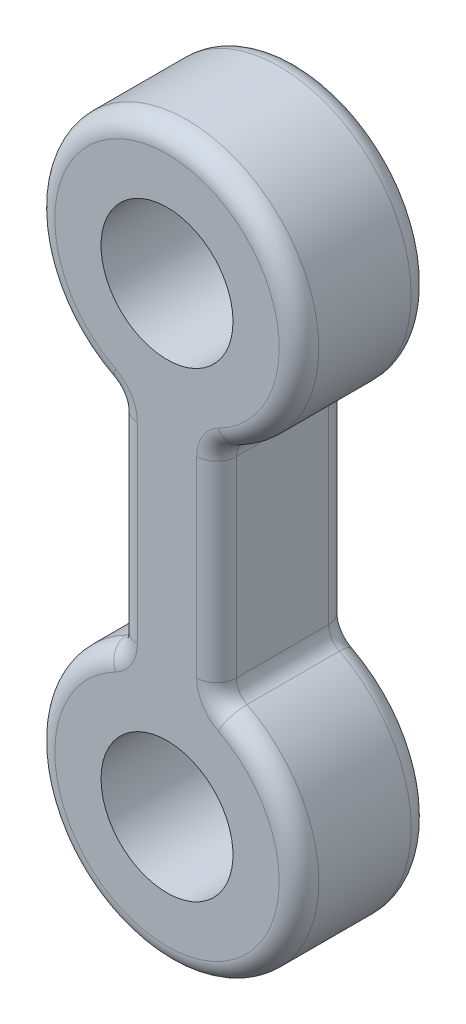
ISO-10303-21;
HEADER;
FILE_DESCRIPTION(('STEP AP214'),'2;1');
FILE_NAME('part.step','',(''),(''),'','','');
FILE_SCHEMA(('AUTOMOTIVE_DESIGN { 1 0 10303 214 1 1 1 1 }'));
ENDSEC;
DATA;
#1=APPLICATION_CONTEXT('core data for automotive mechanical design processes');
#2=APPLICATION_PROTOCOL_DEFINITION('international standard','automotive_design',2000,#1);
#3=PRODUCT_CONTEXT('',#1,'mechanical');
#4=PRODUCT('Part','Part','',(#3));
#5=PRODUCT_RELATED_PRODUCT_CATEGORY('part','',(#4));
#6=PRODUCT_DEFINITION_FORMATION('','',#4);
#7=PRODUCT_DEFINITION_CONTEXT('part definition',#1,'design');
#8=PRODUCT_DEFINITION('design','',#6,#7);
#9=PRODUCT_DEFINITION_SHAPE('','',#8);
#10=(LENGTH_UNIT() NAMED_UNIT(*) SI_UNIT(.MILLI.,.METRE.));
#11=(NAMED_UNIT(*) PLANE_ANGLE_UNIT() SI_UNIT($,.RADIAN.));
#12=(NAMED_UNIT(*) SI_UNIT($,.STERADIAN.) SOLID_ANGLE_UNIT());
#13=UNCERTAINTY_MEASURE_WITH_UNIT(LENGTH_MEASURE(1.E-05),#10,'distance_accuracy_value','');
#14=(GEOMETRIC_REPRESENTATION_CONTEXT(3) GLOBAL_UNCERTAINTY_ASSIGNED_CONTEXT((#13)) GLOBAL_UNIT_ASSIGNED_CONTEXT((#10,
#11,#12)) REPRESENTATION_CONTEXT('',''));
#15=CARTESIAN_POINT('',(0.,0.,0.));
#16=DIRECTION('',(0.,0.,1.));
#17=DIRECTION('',(1.,0.,0.));
#18=AXIS2_PLACEMENT_3D('',#15,#16,#17);
#19=CARTESIAN_POINT('',(0.,35.,-10.));
#20=DIRECTION('',(0.,0.,1.));
#21=DIRECTION('',(1.,0.,0.));
#22=AXIS2_PLACEMENT_3D('',#19,#20,#21);
#23=PLANE('',#22);
#24=CARTESIAN_POINT('',(0.,-35.,-10.));
#25=DIRECTION('',(0.,0.,1.));
#26=DIRECTION('',(-1.,0.,0.));
#27=AXIS2_PLACEMENT_3D('',#24,#25,#26);
#28=CIRCLE('',#27,10.);
#29=CARTESIAN_POINT('',(-10.,-35.,-10.));
#30=VERTEX_POINT('',#29);
#31=EDGE_CURVE('E204',#30,#30,#28,.T.);
#32=ORIENTED_EDGE('',*,*,#31,.T.);
#33=EDGE_LOOP('',(#32));
#34=FACE_BOUND('',#33,.T.);
#35=CARTESIAN_POINT('',(0.,35.,-10.));
#36=DIRECTION('',(0.,0.,1.));
#37=DIRECTION('',(1.,0.,0.));
#38=AXIS2_PLACEMENT_3D('',#35,#36,#37);
#39=CIRCLE('',#38,10.);
#40=CARTESIAN_POINT('',(10.,35.,-10.));
#41=VERTEX_POINT('',#40);
#42=EDGE_CURVE('E215',#41,#41,#39,.T.);
#43=ORIENTED_EDGE('',*,*,#42,.T.);
#44=EDGE_LOOP('',(#43));
#45=FACE_BOUND('',#44,.T.);
#46=CARTESIAN_POINT('',(10.5,-14.5366180703189,-10.));
#47=DIRECTION('',(0.,0.,1.));
#48=DIRECTION('',(1.,0.,0.));
#49=AXIS2_PLACEMENT_3D('',#46,#47,#48);
#50=CIRCLE('',#49,6.);
#51=CARTESIAN_POINT('',(7.76086956521739,-19.8748916171922,-10.));
#52=VERTEX_POINT('',#51);
#53=CARTESIAN_POINT('',(4.49999999999999,-14.5366180703189,-10.));
#54=VERTEX_POINT('',#53);
#55=EDGE_CURVE('E260',#52,#54,#50,.F.);
#56=ORIENTED_EDGE('',*,*,#55,.F.);
#57=CARTESIAN_POINT('',(0.,-35.,-10.));
#58=DIRECTION('',(0.,0.,1.));
#59=DIRECTION('',(1.,0.,0.));
#60=AXIS2_PLACEMENT_3D('',#57,#58,#59);
#61=CIRCLE('',#60,17.);
#62=CARTESIAN_POINT('',(-7.76086956521739,-19.8748916171922,-10.));
#63=VERTEX_POINT('',#62);
#64=EDGE_CURVE('E258',#52,#63,#61,.F.);
#65=ORIENTED_EDGE('',*,*,#64,.T.);
#66=CARTESIAN_POINT('',(-10.5,-14.5366180703189,-10.));
#67=DIRECTION('',(0.,0.,1.));
#68=DIRECTION('',(1.,0.,0.));
#69=AXIS2_PLACEMENT_3D('',#66,#67,#68);
#70=CIRCLE('',#69,6.);
#71=CARTESIAN_POINT('',(-4.5,-14.5366180703189,-10.));
#72=VERTEX_POINT('',#71);
#73=EDGE_CURVE('E256',#72,#63,#70,.F.);
#74=ORIENTED_EDGE('',*,*,#73,.F.);
#75=DIRECTION('',(0.,-1.,0.));
#76=VECTOR('',#75,1.);
#77=CARTESIAN_POINT('',(-4.5,35.,-10.));
#78=LINE('',#77,#76);
#79=CARTESIAN_POINT('',(-4.5,14.5366180703189,-10.));
#80=VERTEX_POINT('',#79);
#81=EDGE_CURVE('E251',#72,#80,#78,.F.);
#82=ORIENTED_EDGE('',*,*,#81,.T.);
#83=CARTESIAN_POINT('',(-10.5,14.5366180703189,-10.));
#84=DIRECTION('',(0.,0.,1.));
#85=DIRECTION('',(1.,0.,0.));
#86=AXIS2_PLACEMENT_3D('',#83,#84,#85);
#87=CIRCLE('',#86,6.);
#88=CARTESIAN_POINT('',(-7.76086956521739,19.8748916171922,-10.));
#89=VERTEX_POINT('',#88);
#90=EDGE_CURVE('E249',#89,#80,#87,.F.);
#91=ORIENTED_EDGE('',*,*,#90,.F.);
#92=CARTESIAN_POINT('',(0.,35.,-10.));
#93=DIRECTION('',(0.,0.,1.));
#94=DIRECTION('',(1.,0.,0.));
#95=AXIS2_PLACEMENT_3D('',#92,#93,#94);
#96=CIRCLE('',#95,17.);
#97=CARTESIAN_POINT('',(7.76086956521739,19.8748916171922,-10.));
#98=VERTEX_POINT('',#97);
#99=EDGE_CURVE('E247',#89,#98,#96,.F.);
#100=ORIENTED_EDGE('',*,*,#99,.T.);
#101=CARTESIAN_POINT('',(10.5,14.5366180703189,-10.));
#102=DIRECTION('',(0.,0.,1.));
#103=DIRECTION('',(1.,0.,0.));
#104=AXIS2_PLACEMENT_3D('',#101,#102,#103);
#105=CIRCLE('',#104,6.);
#106=CARTESIAN_POINT('',(4.5,14.5366180703189,-10.));
#107=VERTEX_POINT('',#106);
#108=EDGE_CURVE('E244',#107,#98,#105,.F.);
#109=ORIENTED_EDGE('',*,*,#108,.F.);
#110=DIRECTION('',(0.,1.,0.));
#111=VECTOR('',#110,1.);
#112=CARTESIAN_POINT('',(4.5,35.,-10.));
#113=LINE('',#112,#111);
#114=EDGE_CURVE('E253',#107,#54,#113,.F.);
#115=ORIENTED_EDGE('',*,*,#114,.T.);
#116=EDGE_LOOP('',(#56,#65,#74,#82,#91,#100,#109,#115));
#117=FACE_BOUND('',#116,.T.);
#118=ADVANCED_FACE('F33',(#34,#45,#117),#23,.F.);
#119=CARTESIAN_POINT('',(0.,35.,10.));
#120=DIRECTION('',(0.,0.,1.));
#121=DIRECTION('',(1.,0.,0.));
#122=AXIS2_PLACEMENT_3D('',#119,#120,#121);
#123=PLANE('',#122);
#124=CARTESIAN_POINT('',(0.,-35.,10.));
#125=DIRECTION('',(0.,0.,1.));
#126=DIRECTION('',(-1.,0.,0.));
#127=AXIS2_PLACEMENT_3D('',#124,#125,#126);
#128=CIRCLE('',#127,10.);
#129=CARTESIAN_POINT('',(-10.,-35.,10.));
#130=VERTEX_POINT('',#129);
#131=EDGE_CURVE('E210',#130,#130,#128,.T.);
#132=ORIENTED_EDGE('',*,*,#131,.F.);
#133=EDGE_LOOP('',(#132));
#134=FACE_BOUND('',#133,.T.);
#135=CARTESIAN_POINT('',(0.,35.,10.));
#136=DIRECTION('',(0.,0.,1.));
#137=DIRECTION('',(1.,0.,0.));
#138=AXIS2_PLACEMENT_3D('',#135,#136,#137);
#139=CIRCLE('',#138,10.);
#140=CARTESIAN_POINT('',(10.,35.,10.));
#141=VERTEX_POINT('',#140);
#142=EDGE_CURVE('E156',#141,#141,#139,.T.);
#143=ORIENTED_EDGE('',*,*,#142,.F.);
#144=EDGE_LOOP('',(#143));
#145=FACE_BOUND('',#144,.T.);
#146=CARTESIAN_POINT('',(-10.5,-14.5366180703189,10.));
#147=DIRECTION('',(0.,0.,1.));
#148=DIRECTION('',(1.,0.,0.));
#149=AXIS2_PLACEMENT_3D('',#146,#147,#148);
#150=CIRCLE('',#149,6.);
#151=CARTESIAN_POINT('',(-7.76086956521739,-19.8748916171922,10.));
#152=VERTEX_POINT('',#151);
#153=CARTESIAN_POINT('',(-4.5,-14.5366180703189,10.));
#154=VERTEX_POINT('',#153);
#155=EDGE_CURVE('E233',#152,#154,#150,.T.);
#156=ORIENTED_EDGE('',*,*,#155,.F.);
#157=CARTESIAN_POINT('',(0.,-35.,10.));
#158=DIRECTION('',(0.,0.,1.));
#159=DIRECTION('',(1.,0.,0.));
#160=AXIS2_PLACEMENT_3D('',#157,#158,#159);
#161=CIRCLE('',#160,17.);
#162=CARTESIAN_POINT('',(7.76086956521739,-19.8748916171922,10.));
#163=VERTEX_POINT('',#162);
#164=EDGE_CURVE('E231',#152,#163,#161,.T.);
#165=ORIENTED_EDGE('',*,*,#164,.T.);
#166=CARTESIAN_POINT('',(10.5,-14.5366180703189,10.));
#167=DIRECTION('',(0.,0.,1.));
#168=DIRECTION('',(1.,0.,0.));
#169=AXIS2_PLACEMENT_3D('',#166,#167,#168);
#170=CIRCLE('',#169,6.);
#171=CARTESIAN_POINT('',(4.49999999999999,-14.5366180703189,10.));
#172=VERTEX_POINT('',#171);
#173=EDGE_CURVE('E228',#172,#163,#170,.T.);
#174=ORIENTED_EDGE('',*,*,#173,.F.);
#175=DIRECTION('',(0.,1.,0.));
#176=VECTOR('',#175,1.);
#177=CARTESIAN_POINT('',(4.5,16.4595037822608,10.));
#178=LINE('',#177,#176);
#179=CARTESIAN_POINT('',(4.5,14.5366180703189,10.));
#180=VERTEX_POINT('',#179);
#181=EDGE_CURVE('E225',#172,#180,#178,.T.);
#182=ORIENTED_EDGE('',*,*,#181,.T.);
#183=CARTESIAN_POINT('',(10.5,14.5366180703189,10.));
#184=DIRECTION('',(0.,0.,1.));
#185=DIRECTION('',(1.,0.,0.));
#186=AXIS2_PLACEMENT_3D('',#183,#184,#185);
#187=CIRCLE('',#186,6.);
#188=CARTESIAN_POINT('',(7.76086956521739,19.8748916171922,10.));
#189=VERTEX_POINT('',#188);
#190=EDGE_CURVE('E167',#189,#180,#187,.T.);
#191=ORIENTED_EDGE('',*,*,#190,.F.);
#192=CARTESIAN_POINT('',(0.,35.,10.));
#193=DIRECTION('',(0.,0.,1.));
#194=DIRECTION('',(1.,0.,0.));
#195=AXIS2_PLACEMENT_3D('',#192,#193,#194);
#196=CIRCLE('',#195,17.);
#197=CARTESIAN_POINT('',(-7.76086956521739,19.8748916171922,10.));
#198=VERTEX_POINT('',#197);
#199=EDGE_CURVE('E151',#189,#198,#196,.T.);
#200=ORIENTED_EDGE('',*,*,#199,.T.);
#201=CARTESIAN_POINT('',(-10.5,14.5366180703189,10.));
#202=DIRECTION('',(0.,0.,1.));
#203=DIRECTION('',(1.,0.,0.));
#204=AXIS2_PLACEMENT_3D('',#201,#202,#203);
#205=CIRCLE('',#204,6.);
#206=CARTESIAN_POINT('',(-4.5,14.5366180703189,10.));
#207=VERTEX_POINT('',#206);
#208=EDGE_CURVE('E145',#207,#198,#205,.T.);
#209=ORIENTED_EDGE('',*,*,#208,.F.);
#210=DIRECTION('',(0.,-1.,0.));
#211=VECTOR('',#210,1.);
#212=CARTESIAN_POINT('',(-4.5,-16.4595037822608,10.));
#213=LINE('',#212,#211);
#214=EDGE_CURVE('E148',#207,#154,#213,.T.);
#215=ORIENTED_EDGE('',*,*,#214,.T.);
#216=EDGE_LOOP('',(#156,#165,#174,#182,#191,#200,#209,#215));
#217=FACE_BOUND('',#216,.T.);
#218=ADVANCED_FACE('F147',(#134,#145,#217),#123,.T.);
#219=CARTESIAN_POINT('',(0.,35.,10.));
#220=DIRECTION('',(0.,0.,-1.));
#221=DIRECTION('',(-1.,0.,0.));
#222=AXIS2_PLACEMENT_3D('',#219,#220,#221);
#223=CYLINDRICAL_SURFACE('',#222,20.);
#224=CARTESIAN_POINT('',(0.,35.,7.));
#225=DIRECTION('',(0.,0.,1.));
#226=DIRECTION('',(1.,0.,0.));
#227=AXIS2_PLACEMENT_3D('',#224,#225,#226);
#228=CIRCLE('',#227,20.);
#229=CARTESIAN_POINT('',(-9.1304347826087,17.2057548437555,7.));
#230=VERTEX_POINT('',#229);
#231=CARTESIAN_POINT('',(9.1304347826087,17.2057548437555,7.));
#232=VERTEX_POINT('',#231);
#233=EDGE_CURVE('E42',#230,#232,#228,.F.);
#234=ORIENTED_EDGE('',*,*,#233,.T.);
#235=DIRECTION('',(0.,0.,-1.));
#236=VECTOR('',#235,1.);
#237=CARTESIAN_POINT('',(9.1304347826087,17.2057548437555,10.));
#238=LINE('',#237,#236);
#239=CARTESIAN_POINT('',(9.1304347826087,17.2057548437555,-7.));
#240=VERTEX_POINT('',#239);
#241=EDGE_CURVE('E11',#232,#240,#238,.T.);
#242=ORIENTED_EDGE('',*,*,#241,.T.);
#243=CARTESIAN_POINT('',(0.,35.,-7.));
#244=DIRECTION('',(0.,0.,1.));
#245=DIRECTION('',(1.,0.,0.));
#246=AXIS2_PLACEMENT_3D('',#243,#244,#245);
#247=CIRCLE('',#246,20.);
#248=CARTESIAN_POINT('',(-9.1304347826087,17.2057548437555,-7.));
#249=VERTEX_POINT('',#248);
#250=EDGE_CURVE('E280',#240,#249,#247,.T.);
#251=ORIENTED_EDGE('',*,*,#250,.T.);
#252=DIRECTION('',(0.,0.,-1.));
#253=VECTOR('',#252,1.);
#254=CARTESIAN_POINT('',(-9.1304347826087,17.2057548437555,10.));
#255=LINE('',#254,#253);
#256=EDGE_CURVE('E53',#249,#230,#255,.F.);
#257=ORIENTED_EDGE('',*,*,#256,.T.);
#258=EDGE_LOOP('',(#234,#242,#251,#257));
#259=FACE_BOUND('',#258,.T.);
#260=ADVANCED_FACE('F323',(#259),#223,.T.);
#261=CARTESIAN_POINT('',(-7.5,16.4595037822608,10.));
#262=DIRECTION('',(1.,0.,0.));
#263=DIRECTION('',(0.,1.,0.));
#264=AXIS2_PLACEMENT_3D('',#261,#262,#263);
#265=PLANE('',#264);
#266=DIRECTION('',(0.,-1.,0.));
#267=VECTOR('',#266,1.);
#268=CARTESIAN_POINT('',(-7.5,16.4595037822608,-7.));
#269=LINE('',#268,#267);
#270=CARTESIAN_POINT('',(-7.5,14.5366180703189,-7.));
#271=VERTEX_POINT('',#270);
#272=CARTESIAN_POINT('',(-7.5,-14.5366180703189,-7.));
#273=VERTEX_POINT('',#272);
#274=EDGE_CURVE('E264',#271,#273,#269,.T.);
#275=ORIENTED_EDGE('',*,*,#274,.T.);
#276=DIRECTION('',(0.,0.,1.));
#277=VECTOR('',#276,1.);
#278=CARTESIAN_POINT('',(-7.5,-14.5366180703189,10.));
#279=LINE('',#278,#277);
#280=CARTESIAN_POINT('',(-7.5,-14.5366180703189,7.));
#281=VERTEX_POINT('',#280);
#282=EDGE_CURVE('E269',#273,#281,#279,.T.);
#283=ORIENTED_EDGE('',*,*,#282,.T.);
#284=DIRECTION('',(0.,-1.,0.));
#285=VECTOR('',#284,1.);
#286=CARTESIAN_POINT('',(-7.5,16.4595037822608,7.));
#287=LINE('',#286,#285);
#288=CARTESIAN_POINT('',(-7.5,14.5366180703189,7.));
#289=VERTEX_POINT('',#288);
#290=EDGE_CURVE('E266',#281,#289,#287,.F.);
#291=ORIENTED_EDGE('',*,*,#290,.T.);
#292=DIRECTION('',(0.,0.,1.));
#293=VECTOR('',#292,1.);
#294=CARTESIAN_POINT('',(-7.5,14.5366180703189,-10.));
#295=LINE('',#294,#293);
#296=EDGE_CURVE('E262',#289,#271,#295,.F.);
#297=ORIENTED_EDGE('',*,*,#296,.T.);
#298=EDGE_LOOP('',(#275,#283,#291,#297));
#299=FACE_BOUND('',#298,.T.);
#300=ADVANCED_FACE('F355',(#299),#265,.F.);
#301=CARTESIAN_POINT('',(0.,-35.,10.));
#302=DIRECTION('',(0.,0.,-1.));
#303=DIRECTION('',(-1.,0.,0.));
#304=AXIS2_PLACEMENT_3D('',#301,#302,#303);
#305=CYLINDRICAL_SURFACE('',#304,20.);
#306=CARTESIAN_POINT('',(0.,-35.,7.));
#307=DIRECTION('',(0.,0.,1.));
#308=DIRECTION('',(1.,0.,0.));
#309=AXIS2_PLACEMENT_3D('',#306,#307,#308);
#310=CIRCLE('',#309,20.);
#311=CARTESIAN_POINT('',(9.13043478260869,-17.2057548437555,7.));
#312=VERTEX_POINT('',#311);
#313=CARTESIAN_POINT('',(-9.1304347826087,-17.2057548437555,7.));
#314=VERTEX_POINT('',#313);
#315=EDGE_CURVE('E275',#312,#314,#310,.F.);
#316=ORIENTED_EDGE('',*,*,#315,.T.);
#317=DIRECTION('',(0.,0.,-1.));
#318=VECTOR('',#317,1.);
#319=CARTESIAN_POINT('',(-9.1304347826087,-17.2057548437555,10.));
#320=LINE('',#319,#318);
#321=CARTESIAN_POINT('',(-9.1304347826087,-17.2057548437555,-7.));
#322=VERTEX_POINT('',#321);
#323=EDGE_CURVE('E277',#314,#322,#320,.T.);
#324=ORIENTED_EDGE('',*,*,#323,.T.);
#325=CARTESIAN_POINT('',(0.,-35.,-7.));
#326=DIRECTION('',(0.,0.,1.));
#327=DIRECTION('',(1.,0.,0.));
#328=AXIS2_PLACEMENT_3D('',#325,#326,#327);
#329=CIRCLE('',#328,20.);
#330=CARTESIAN_POINT('',(9.13043478260869,-17.2057548437555,-7.));
#331=VERTEX_POINT('',#330);
#332=EDGE_CURVE('E271',#322,#331,#329,.T.);
#333=ORIENTED_EDGE('',*,*,#332,.T.);
#334=DIRECTION('',(0.,0.,-1.));
#335=VECTOR('',#334,1.);
#336=CARTESIAN_POINT('',(9.13043478260869,-17.2057548437555,10.));
#337=LINE('',#336,#335);
#338=EDGE_CURVE('E273',#331,#312,#337,.F.);
#339=ORIENTED_EDGE('',*,*,#338,.T.);
#340=EDGE_LOOP('',(#316,#324,#333,#339));
#341=FACE_BOUND('',#340,.T.);
#342=ADVANCED_FACE('F384',(#341),#305,.T.);
#343=CARTESIAN_POINT('',(7.5,16.4595037822608,10.));
#344=DIRECTION('',(-1.,0.,0.));
#345=DIRECTION('',(0.,-1.,0.));
#346=AXIS2_PLACEMENT_3D('',#343,#344,#345);
#347=PLANE('',#346);
#348=DIRECTION('',(0.,1.,0.));
#349=VECTOR('',#348,1.);
#350=CARTESIAN_POINT('',(7.49999999999999,-16.4595037822608,7.));
#351=LINE('',#350,#349);
#352=CARTESIAN_POINT('',(7.5,14.5366180703189,7.));
#353=VERTEX_POINT('',#352);
#354=CARTESIAN_POINT('',(7.49999999999999,-14.5366180703189,7.));
#355=VERTEX_POINT('',#354);
#356=EDGE_CURVE('E239',#353,#355,#351,.F.);
#357=ORIENTED_EDGE('',*,*,#356,.T.);
#358=DIRECTION('',(0.,0.,1.));
#359=VECTOR('',#358,1.);
#360=CARTESIAN_POINT('',(7.49999999999999,-14.5366180703189,-10.));
#361=LINE('',#360,#359);
#362=CARTESIAN_POINT('',(7.49999999999999,-14.5366180703189,-7.));
#363=VERTEX_POINT('',#362);
#364=EDGE_CURVE('E242',#355,#363,#361,.F.);
#365=ORIENTED_EDGE('',*,*,#364,.T.);
#366=DIRECTION('',(0.,1.,0.));
#367=VECTOR('',#366,1.);
#368=CARTESIAN_POINT('',(7.5,16.4595037822608,-7.));
#369=LINE('',#368,#367);
#370=CARTESIAN_POINT('',(7.5,14.5366180703189,-7.));
#371=VERTEX_POINT('',#370);
#372=EDGE_CURVE('E237',#363,#371,#369,.T.);
#373=ORIENTED_EDGE('',*,*,#372,.T.);
#374=DIRECTION('',(0.,0.,1.));
#375=VECTOR('',#374,1.);
#376=CARTESIAN_POINT('',(7.5,14.5366180703189,10.));
#377=LINE('',#376,#375);
#378=EDGE_CURVE('E235',#371,#353,#377,.T.);
#379=ORIENTED_EDGE('',*,*,#378,.T.);
#380=EDGE_LOOP('',(#357,#365,#373,#379));
#381=FACE_BOUND('',#380,.T.);
#382=ADVANCED_FACE('F339',(#381),#347,.F.);
#383=CARTESIAN_POINT('',(0.,35.,10.));
#384=DIRECTION('',(0.,0.,-1.));
#385=DIRECTION('',(-1.,0.,0.));
#386=AXIS2_PLACEMENT_3D('',#383,#384,#385);
#387=CYLINDRICAL_SURFACE('',#386,10.);
#388=ORIENTED_EDGE('',*,*,#142,.T.);
#389=EDGE_LOOP('',(#388));
#390=FACE_BOUND('',#389,.T.);
#391=ORIENTED_EDGE('',*,*,#42,.F.);
#392=EDGE_LOOP('',(#391));
#393=FACE_BOUND('',#392,.T.);
#394=ADVANCED_FACE('F391',(#390,#393),#387,.F.);
#395=CARTESIAN_POINT('',(0.,-35.,10.));
#396=DIRECTION('',(0.,0.,-1.));
#397=DIRECTION('',(-1.,0.,0.));
#398=AXIS2_PLACEMENT_3D('',#395,#396,#397);
#399=CYLINDRICAL_SURFACE('',#398,10.);
#400=ORIENTED_EDGE('',*,*,#131,.T.);
#401=EDGE_LOOP('',(#400));
#402=FACE_BOUND('',#401,.T.);
#403=ORIENTED_EDGE('',*,*,#31,.F.);
#404=EDGE_LOOP('',(#403));
#405=FACE_BOUND('',#404,.T.);
#406=ADVANCED_FACE('F405',(#402,#405),#399,.F.);
#407=CARTESIAN_POINT('',(-4.5,16.4595037822608,-7.));
#408=DIRECTION('',(0.,-1.,0.));
#409=DIRECTION('',(1.,0.,0.));
#410=AXIS2_PLACEMENT_3D('',#407,#408,#409);
#411=CYLINDRICAL_SURFACE('',#410,3.);
#412=CARTESIAN_POINT('',(-4.5,14.5366180703189,-7.));
#413=DIRECTION('',(0.,1.,0.));
#414=DIRECTION('',(0.,0.,1.));
#415=AXIS2_PLACEMENT_3D('',#412,#413,#414);
#416=CIRCLE('',#415,3.);
#417=EDGE_CURVE('E197',#80,#271,#416,.T.);
#418=ORIENTED_EDGE('',*,*,#417,.F.);
#419=ORIENTED_EDGE('',*,*,#81,.F.);
#420=CARTESIAN_POINT('',(-4.5,-14.5366180703189,-7.));
#421=DIRECTION('',(0.,-1.,0.));
#422=DIRECTION('',(0.,0.,-1.));
#423=AXIS2_PLACEMENT_3D('',#420,#421,#422);
#424=CIRCLE('',#423,3.);
#425=EDGE_CURVE('E37',#273,#72,#424,.T.);
#426=ORIENTED_EDGE('',*,*,#425,.F.);
#427=ORIENTED_EDGE('',*,*,#274,.F.);
#428=EDGE_LOOP('',(#418,#419,#426,#427));
#429=FACE_BOUND('',#428,.T.);
#430=ADVANCED_FACE('F35',(#429),#411,.T.);
#431=CARTESIAN_POINT('',(-10.5,-14.5366180703189,-7.));
#432=DIRECTION('',(0.,0.,1.));
#433=DIRECTION('',(1.,0.,0.));
#434=AXIS2_PLACEMENT_3D('',#431,#432,#433);
#435=TOROIDAL_SURFACE('',#434,6.,3.);
#436=ORIENTED_EDGE('',*,*,#425,.T.);
#437=ORIENTED_EDGE('',*,*,#73,.T.);
#438=CARTESIAN_POINT('',(-7.76086956521739,-19.8748916171922,-7.));
#439=DIRECTION('',(0.889712257812223,0.456521739130435,0.));
#440=DIRECTION('',(-0.456521739130435,0.889712257812223,0.));
#441=AXIS2_PLACEMENT_3D('',#438,#439,#440);
#442=CIRCLE('',#441,3.);
#443=EDGE_CURVE('E195',#322,#63,#442,.F.);
#444=ORIENTED_EDGE('',*,*,#443,.F.);
#445=CARTESIAN_POINT('',(-10.5,-14.5366180703189,-7.));
#446=DIRECTION('',(0.,0.,1.));
#447=DIRECTION('',(1.,0.,0.));
#448=AXIS2_PLACEMENT_3D('',#445,#446,#447);
#449=CIRCLE('',#448,3.);
#450=EDGE_CURVE('E192',#273,#322,#449,.F.);
#451=ORIENTED_EDGE('',*,*,#450,.F.);
#452=EDGE_LOOP('',(#436,#437,#444,#451));
#453=FACE_BOUND('',#452,.T.);
#454=ADVANCED_FACE('F382',(#453),#435,.T.);
#455=CARTESIAN_POINT('',(-10.5,14.5366180703189,-7.));
#456=DIRECTION('',(0.,0.,1.));
#457=DIRECTION('',(1.,0.,0.));
#458=AXIS2_PLACEMENT_3D('',#455,#456,#457);
#459=TOROIDAL_SURFACE('',#458,6.,3.);
#460=ORIENTED_EDGE('',*,*,#90,.T.);
#461=ORIENTED_EDGE('',*,*,#417,.T.);
#462=CARTESIAN_POINT('',(-10.5,14.5366180703189,-7.));
#463=DIRECTION('',(0.,0.,1.));
#464=DIRECTION('',(1.,0.,0.));
#465=AXIS2_PLACEMENT_3D('',#462,#463,#464);
#466=CIRCLE('',#465,3.);
#467=EDGE_CURVE('E189',#249,#271,#466,.F.);
#468=ORIENTED_EDGE('',*,*,#467,.F.);
#469=CARTESIAN_POINT('',(-7.76086956521739,19.8748916171922,-7.));
#470=DIRECTION('',(0.889712257812223,-0.456521739130435,0.));
#471=DIRECTION('',(0.456521739130435,0.889712257812223,0.));
#472=AXIS2_PLACEMENT_3D('',#469,#470,#471);
#473=CIRCLE('',#472,3.);
#474=EDGE_CURVE('E186',#89,#249,#473,.F.);
#475=ORIENTED_EDGE('',*,*,#474,.F.);
#476=EDGE_LOOP('',(#460,#461,#468,#475));
#477=FACE_BOUND('',#476,.T.);
#478=ADVANCED_FACE('F350',(#477),#459,.T.);
#479=CARTESIAN_POINT('',(0.,-35.,-7.));
#480=DIRECTION('',(0.,0.,1.));
#481=DIRECTION('',(1.,0.,0.));
#482=AXIS2_PLACEMENT_3D('',#479,#480,#481);
#483=TOROIDAL_SURFACE('',#482,17.,3.);
#484=ORIENTED_EDGE('',*,*,#443,.T.);
#485=ORIENTED_EDGE('',*,*,#64,.F.);
#486=CARTESIAN_POINT('',(7.76086956521739,-19.8748916171922,-7.));
#487=DIRECTION('',(-0.889712257812223,0.456521739130435,0.));
#488=DIRECTION('',(-0.456521739130435,-0.889712257812223,0.));
#489=AXIS2_PLACEMENT_3D('',#486,#487,#488);
#490=CIRCLE('',#489,3.);
#491=EDGE_CURVE('E180',#331,#52,#490,.T.);
#492=ORIENTED_EDGE('',*,*,#491,.F.);
#493=ORIENTED_EDGE('',*,*,#332,.F.);
#494=EDGE_LOOP('',(#484,#485,#492,#493));
#495=FACE_BOUND('',#494,.T.);
#496=ADVANCED_FACE('F380',(#495),#483,.T.);
#497=CARTESIAN_POINT('',(-10.5,-14.5366180703189,10.));
#498=DIRECTION('',(0.,0.,-1.));
#499=DIRECTION('',(-1.,0.,0.));
#500=AXIS2_PLACEMENT_3D('',#497,#498,#499);
#501=CYLINDRICAL_SURFACE('',#500,3.);
#502=ORIENTED_EDGE('',*,*,#450,.T.);
#503=ORIENTED_EDGE('',*,*,#323,.F.);
#504=CARTESIAN_POINT('',(-10.5,-14.5366180703189,7.));
#505=DIRECTION('',(0.,0.,1.));
#506=DIRECTION('',(1.,0.,0.));
#507=AXIS2_PLACEMENT_3D('',#504,#505,#506);
#508=CIRCLE('',#507,3.);
#509=EDGE_CURVE('E172',#281,#314,#508,.F.);
#510=ORIENTED_EDGE('',*,*,#509,.F.);
#511=ORIENTED_EDGE('',*,*,#282,.F.);
#512=EDGE_LOOP('',(#502,#503,#510,#511));
#513=FACE_BOUND('',#512,.T.);
#514=ADVANCED_FACE('F360',(#513),#501,.F.);
#515=CARTESIAN_POINT('',(-4.5,35.,7.));
#516=DIRECTION('',(0.,1.,0.));
#517=DIRECTION('',(-1.,0.,0.));
#518=AXIS2_PLACEMENT_3D('',#515,#516,#517);
#519=CYLINDRICAL_SURFACE('',#518,3.);
#520=CARTESIAN_POINT('',(-4.5,14.5366180703189,7.));
#521=DIRECTION('',(0.,1.,0.));
#522=DIRECTION('',(0.,0.,1.));
#523=AXIS2_PLACEMENT_3D('',#520,#521,#522);
#524=CIRCLE('',#523,3.);
#525=EDGE_CURVE('E162',#289,#207,#524,.T.);
#526=ORIENTED_EDGE('',*,*,#525,.F.);
#527=ORIENTED_EDGE('',*,*,#290,.F.);
#528=CARTESIAN_POINT('',(-4.5,-14.5366180703189,7.));
#529=DIRECTION('',(0.,-1.,0.));
#530=DIRECTION('',(0.,0.,-1.));
#531=AXIS2_PLACEMENT_3D('',#528,#529,#530);
#532=CIRCLE('',#531,3.);
#533=EDGE_CURVE('E165',#154,#281,#532,.T.);
#534=ORIENTED_EDGE('',*,*,#533,.F.);
#535=ORIENTED_EDGE('',*,*,#214,.F.);
#536=EDGE_LOOP('',(#526,#527,#534,#535));
#537=FACE_BOUND('',#536,.T.);
#538=ADVANCED_FACE('F160',(#537),#519,.T.);
#539=CARTESIAN_POINT('',(-10.5,14.5366180703189,10.));
#540=DIRECTION('',(0.,0.,-1.));
#541=DIRECTION('',(-1.,0.,0.));
#542=AXIS2_PLACEMENT_3D('',#539,#540,#541);
#543=CYLINDRICAL_SURFACE('',#542,3.);
#544=ORIENTED_EDGE('',*,*,#467,.T.);
#545=ORIENTED_EDGE('',*,*,#296,.F.);
#546=CARTESIAN_POINT('',(-10.5,14.5366180703189,7.));
#547=DIRECTION('',(0.,0.,1.));
#548=DIRECTION('',(1.,0.,0.));
#549=AXIS2_PLACEMENT_3D('',#546,#547,#548);
#550=CIRCLE('',#549,3.);
#551=EDGE_CURVE('E170',#230,#289,#550,.F.);
#552=ORIENTED_EDGE('',*,*,#551,.F.);
#553=ORIENTED_EDGE('',*,*,#256,.F.);
#554=EDGE_LOOP('',(#544,#545,#552,#553));
#555=FACE_BOUND('',#554,.T.);
#556=ADVANCED_FACE('F352',(#555),#543,.F.);
#557=CARTESIAN_POINT('',(0.,35.,-7.));
#558=DIRECTION('',(0.,0.,1.));
#559=DIRECTION('',(1.,0.,0.));
#560=AXIS2_PLACEMENT_3D('',#557,#558,#559);
#561=TOROIDAL_SURFACE('',#560,17.,3.);
#562=ORIENTED_EDGE('',*,*,#474,.T.);
#563=ORIENTED_EDGE('',*,*,#250,.F.);
#564=CARTESIAN_POINT('',(7.76086956521739,19.8748916171922,-7.));
#565=DIRECTION('',(-0.889712257812223,-0.456521739130435,0.));
#566=DIRECTION('',(0.456521739130435,-0.889712257812223,0.));
#567=AXIS2_PLACEMENT_3D('',#564,#565,#566);
#568=CIRCLE('',#567,3.);
#569=EDGE_CURVE('E174',#98,#240,#568,.T.);
#570=ORIENTED_EDGE('',*,*,#569,.F.);
#571=ORIENTED_EDGE('',*,*,#99,.F.);
#572=EDGE_LOOP('',(#562,#563,#570,#571));
#573=FACE_BOUND('',#572,.T.);
#574=ADVANCED_FACE('F321',(#573),#561,.T.);
#575=CARTESIAN_POINT('',(4.5,16.4595037822608,-7.));
#576=DIRECTION('',(0.,1.,0.));
#577=DIRECTION('',(-1.,0.,0.));
#578=AXIS2_PLACEMENT_3D('',#575,#576,#577);
#579=CYLINDRICAL_SURFACE('',#578,3.);
#580=CARTESIAN_POINT('',(4.49999999999999,-14.5366180703189,-7.));
#581=DIRECTION('',(0.,-1.,0.));
#582=DIRECTION('',(0.,0.,-1.));
#583=AXIS2_PLACEMENT_3D('',#580,#581,#582);
#584=CIRCLE('',#583,3.);
#585=EDGE_CURVE('E183',#54,#363,#584,.T.);
#586=ORIENTED_EDGE('',*,*,#585,.F.);
#587=ORIENTED_EDGE('',*,*,#114,.F.);
#588=CARTESIAN_POINT('',(4.5,14.5366180703189,-7.));
#589=DIRECTION('',(0.,1.,0.));
#590=DIRECTION('',(0.,0.,1.));
#591=AXIS2_PLACEMENT_3D('',#588,#589,#590);
#592=CIRCLE('',#591,3.);
#593=EDGE_CURVE('E310',#371,#107,#592,.T.);
#594=ORIENTED_EDGE('',*,*,#593,.F.);
#595=ORIENTED_EDGE('',*,*,#372,.F.);
#596=EDGE_LOOP('',(#586,#587,#594,#595));
#597=FACE_BOUND('',#596,.T.);
#598=ADVANCED_FACE('F346',(#597),#579,.T.);
#599=CARTESIAN_POINT('',(10.5,-14.5366180703189,-7.));
#600=DIRECTION('',(0.,0.,1.));
#601=DIRECTION('',(1.,0.,0.));
#602=AXIS2_PLACEMENT_3D('',#599,#600,#601);
#603=TOROIDAL_SURFACE('',#602,6.,3.);
#604=ORIENTED_EDGE('',*,*,#55,.T.);
#605=ORIENTED_EDGE('',*,*,#585,.T.);
#606=CARTESIAN_POINT('',(10.5,-14.5366180703189,-7.));
#607=DIRECTION('',(0.,0.,1.));
#608=DIRECTION('',(1.,0.,0.));
#609=AXIS2_PLACEMENT_3D('',#606,#607,#608);
#610=CIRCLE('',#609,3.);
#611=EDGE_CURVE('E307',#331,#363,#610,.F.);
#612=ORIENTED_EDGE('',*,*,#611,.F.);
#613=ORIENTED_EDGE('',*,*,#491,.T.);
#614=EDGE_LOOP('',(#604,#605,#612,#613));
#615=FACE_BOUND('',#614,.T.);
#616=ADVANCED_FACE('F377',(#615),#603,.T.);
#617=CARTESIAN_POINT('',(-10.5,-14.5366180703189,7.));
#618=DIRECTION('',(0.,0.,1.));
#619=DIRECTION('',(1.,0.,0.));
#620=AXIS2_PLACEMENT_3D('',#617,#618,#619);
#621=TOROIDAL_SURFACE('',#620,6.,3.);
#622=ORIENTED_EDGE('',*,*,#533,.T.);
#623=ORIENTED_EDGE('',*,*,#509,.T.);
#624=CARTESIAN_POINT('',(-7.76086956521739,-19.8748916171922,7.));
#625=DIRECTION('',(0.889712257812223,0.456521739130435,0.));
#626=DIRECTION('',(-0.456521739130435,0.889712257812223,0.));
#627=AXIS2_PLACEMENT_3D('',#624,#625,#626);
#628=CIRCLE('',#627,3.);
#629=EDGE_CURVE('E304',#152,#314,#628,.F.);
#630=ORIENTED_EDGE('',*,*,#629,.F.);
#631=ORIENTED_EDGE('',*,*,#155,.T.);
#632=EDGE_LOOP('',(#622,#623,#630,#631));
#633=FACE_BOUND('',#632,.T.);
#634=ADVANCED_FACE('F363',(#633),#621,.T.);
#635=CARTESIAN_POINT('',(-10.5,14.5366180703189,7.));
#636=DIRECTION('',(0.,0.,1.));
#637=DIRECTION('',(1.,0.,0.));
#638=AXIS2_PLACEMENT_3D('',#635,#636,#637);
#639=TOROIDAL_SURFACE('',#638,6.,3.);
#640=ORIENTED_EDGE('',*,*,#525,.T.);
#641=ORIENTED_EDGE('',*,*,#208,.T.);
#642=CARTESIAN_POINT('',(-7.76086956521739,19.8748916171922,7.));
#643=DIRECTION('',(0.889712257812223,-0.456521739130435,0.));
#644=DIRECTION('',(0.456521739130435,0.889712257812223,0.));
#645=AXIS2_PLACEMENT_3D('',#642,#643,#644);
#646=CIRCLE('',#645,3.);
#647=EDGE_CURVE('E302',#230,#198,#646,.F.);
#648=ORIENTED_EDGE('',*,*,#647,.F.);
#649=ORIENTED_EDGE('',*,*,#551,.T.);
#650=EDGE_LOOP('',(#640,#641,#648,#649));
#651=FACE_BOUND('',#650,.T.);
#652=ADVANCED_FACE('F169',(#651),#639,.T.);
#653=CARTESIAN_POINT('',(10.5,14.5366180703189,-7.));
#654=DIRECTION('',(0.,0.,1.));
#655=DIRECTION('',(1.,0.,0.));
#656=AXIS2_PLACEMENT_3D('',#653,#654,#655);
#657=TOROIDAL_SURFACE('',#656,6.,3.);
#658=ORIENTED_EDGE('',*,*,#108,.T.);
#659=ORIENTED_EDGE('',*,*,#569,.T.);
#660=CARTESIAN_POINT('',(10.5,14.5366180703189,-7.));
#661=DIRECTION('',(0.,0.,1.));
#662=DIRECTION('',(1.,0.,0.));
#663=AXIS2_PLACEMENT_3D('',#660,#661,#662);
#664=CIRCLE('',#663,3.);
#665=EDGE_CURVE('E300',#371,#240,#664,.F.);
#666=ORIENTED_EDGE('',*,*,#665,.F.);
#667=ORIENTED_EDGE('',*,*,#593,.T.);
#668=EDGE_LOOP('',(#658,#659,#666,#667));
#669=FACE_BOUND('',#668,.T.);
#670=ADVANCED_FACE('F317',(#669),#657,.T.);
#671=CARTESIAN_POINT('',(10.5,-14.5366180703189,10.));
#672=DIRECTION('',(0.,0.,-1.));
#673=DIRECTION('',(-1.,0.,0.));
#674=AXIS2_PLACEMENT_3D('',#671,#672,#673);
#675=CYLINDRICAL_SURFACE('',#674,3.);
#676=ORIENTED_EDGE('',*,*,#611,.T.);
#677=ORIENTED_EDGE('',*,*,#364,.F.);
#678=CARTESIAN_POINT('',(10.5,-14.5366180703189,7.));
#679=DIRECTION('',(0.,0.,1.));
#680=DIRECTION('',(1.,0.,0.));
#681=AXIS2_PLACEMENT_3D('',#678,#679,#680);
#682=CIRCLE('',#681,3.);
#683=EDGE_CURVE('E297',#312,#355,#682,.F.);
#684=ORIENTED_EDGE('',*,*,#683,.F.);
#685=ORIENTED_EDGE('',*,*,#338,.F.);
#686=EDGE_LOOP('',(#676,#677,#684,#685));
#687=FACE_BOUND('',#686,.T.);
#688=ADVANCED_FACE('F374',(#687),#675,.F.);
#689=CARTESIAN_POINT('',(0.,-35.,7.));
#690=DIRECTION('',(0.,0.,1.));
#691=DIRECTION('',(1.,0.,0.));
#692=AXIS2_PLACEMENT_3D('',#689,#690,#691);
#693=TOROIDAL_SURFACE('',#692,17.,3.);
#694=ORIENTED_EDGE('',*,*,#629,.T.);
#695=ORIENTED_EDGE('',*,*,#315,.F.);
#696=CARTESIAN_POINT('',(7.76086956521739,-19.8748916171922,7.));
#697=DIRECTION('',(-0.889712257812223,0.456521739130435,0.));
#698=DIRECTION('',(-0.456521739130435,-0.889712257812223,0.));
#699=AXIS2_PLACEMENT_3D('',#696,#697,#698);
#700=CIRCLE('',#699,3.);
#701=EDGE_CURVE('E294',#163,#312,#700,.T.);
#702=ORIENTED_EDGE('',*,*,#701,.F.);
#703=ORIENTED_EDGE('',*,*,#164,.F.);
#704=EDGE_LOOP('',(#694,#695,#702,#703));
#705=FACE_BOUND('',#704,.T.);
#706=ADVANCED_FACE('F368',(#705),#693,.T.);
#707=CARTESIAN_POINT('',(0.,35.,7.));
#708=DIRECTION('',(0.,0.,1.));
#709=DIRECTION('',(1.,0.,0.));
#710=AXIS2_PLACEMENT_3D('',#707,#708,#709);
#711=TOROIDAL_SURFACE('',#710,17.,3.);
#712=ORIENTED_EDGE('',*,*,#647,.T.);
#713=ORIENTED_EDGE('',*,*,#199,.F.);
#714=CARTESIAN_POINT('',(7.76086956521739,19.8748916171922,7.));
#715=DIRECTION('',(-0.889712257812223,-0.456521739130435,0.));
#716=DIRECTION('',(0.456521739130435,-0.889712257812223,0.));
#717=AXIS2_PLACEMENT_3D('',#714,#715,#716);
#718=CIRCLE('',#717,3.);
#719=EDGE_CURVE('E291',#232,#189,#718,.T.);
#720=ORIENTED_EDGE('',*,*,#719,.F.);
#721=ORIENTED_EDGE('',*,*,#233,.F.);
#722=EDGE_LOOP('',(#712,#713,#720,#721));
#723=FACE_BOUND('',#722,.T.);
#724=ADVANCED_FACE('F330',(#723),#711,.T.);
#725=CARTESIAN_POINT('',(10.5,14.5366180703189,10.));
#726=DIRECTION('',(0.,0.,-1.));
#727=DIRECTION('',(-1.,0.,0.));
#728=AXIS2_PLACEMENT_3D('',#725,#726,#727);
#729=CYLINDRICAL_SURFACE('',#728,3.);
#730=ORIENTED_EDGE('',*,*,#665,.T.);
#731=ORIENTED_EDGE('',*,*,#241,.F.);
#732=CARTESIAN_POINT('',(10.5,14.5366180703189,7.));
#733=DIRECTION('',(0.,0.,1.));
#734=DIRECTION('',(1.,0.,0.));
#735=AXIS2_PLACEMENT_3D('',#732,#733,#734);
#736=CIRCLE('',#735,3.);
#737=EDGE_CURVE('E288',#353,#232,#736,.F.);
#738=ORIENTED_EDGE('',*,*,#737,.F.);
#739=ORIENTED_EDGE('',*,*,#378,.F.);
#740=EDGE_LOOP('',(#730,#731,#738,#739));
#741=FACE_BOUND('',#740,.T.);
#742=ADVANCED_FACE('F327',(#741),#729,.F.);
#743=CARTESIAN_POINT('',(10.5,-14.5366180703189,7.));
#744=DIRECTION('',(0.,0.,1.));
#745=DIRECTION('',(1.,0.,0.));
#746=AXIS2_PLACEMENT_3D('',#743,#744,#745);
#747=TOROIDAL_SURFACE('',#746,6.,3.);
#748=ORIENTED_EDGE('',*,*,#701,.T.);
#749=ORIENTED_EDGE('',*,*,#683,.T.);
#750=CARTESIAN_POINT('',(4.49999999999999,-14.5366180703189,7.));
#751=DIRECTION('',(0.,-1.,0.));
#752=DIRECTION('',(0.,0.,-1.));
#753=AXIS2_PLACEMENT_3D('',#750,#751,#752);
#754=CIRCLE('',#753,3.);
#755=EDGE_CURVE('E286',#172,#355,#754,.F.);
#756=ORIENTED_EDGE('',*,*,#755,.F.);
#757=ORIENTED_EDGE('',*,*,#173,.T.);
#758=EDGE_LOOP('',(#748,#749,#756,#757));
#759=FACE_BOUND('',#758,.T.);
#760=ADVANCED_FACE('F371',(#759),#747,.T.);
#761=CARTESIAN_POINT('',(10.5,14.5366180703189,7.));
#762=DIRECTION('',(0.,0.,1.));
#763=DIRECTION('',(1.,0.,0.));
#764=AXIS2_PLACEMENT_3D('',#761,#762,#763);
#765=TOROIDAL_SURFACE('',#764,6.,3.);
#766=ORIENTED_EDGE('',*,*,#719,.T.);
#767=ORIENTED_EDGE('',*,*,#190,.T.);
#768=CARTESIAN_POINT('',(4.5,14.5366180703189,7.));
#769=DIRECTION('',(0.,1.,0.));
#770=DIRECTION('',(0.,0.,1.));
#771=AXIS2_PLACEMENT_3D('',#768,#769,#770);
#772=CIRCLE('',#771,3.);
#773=EDGE_CURVE('E284',#353,#180,#772,.F.);
#774=ORIENTED_EDGE('',*,*,#773,.F.);
#775=ORIENTED_EDGE('',*,*,#737,.T.);
#776=EDGE_LOOP('',(#766,#767,#774,#775));
#777=FACE_BOUND('',#776,.T.);
#778=ADVANCED_FACE('F333',(#777),#765,.T.);
#779=CARTESIAN_POINT('',(4.5,35.,7.));
#780=DIRECTION('',(0.,-1.,0.));
#781=DIRECTION('',(1.,0.,0.));
#782=AXIS2_PLACEMENT_3D('',#779,#780,#781);
#783=CYLINDRICAL_SURFACE('',#782,3.);
#784=ORIENTED_EDGE('',*,*,#755,.T.);
#785=ORIENTED_EDGE('',*,*,#356,.F.);
#786=ORIENTED_EDGE('',*,*,#773,.T.);
#787=ORIENTED_EDGE('',*,*,#181,.F.);
#788=EDGE_LOOP('',(#784,#785,#786,#787));
#789=FACE_BOUND('',#788,.T.);
#790=ADVANCED_FACE('F336',(#789),#783,.T.);
#791=CLOSED_SHELL('',(#118,#218,#260,#300,#342,#382,#394,#406,#430,#454,#478,#496,#514,#538,
#556,#574,#598,#616,#634,#652,#670,#688,#706,#724,#742,#760,#778,#790));
#792=MANIFOLD_SOLID_BREP('B2',#791);
#793=ADVANCED_BREP_SHAPE_REPRESENTATION('',(#18,#792),#14);
#794=SHAPE_DEFINITION_REPRESENTATION(#9,#793);
ENDSEC;
END-ISO-10303-21;
